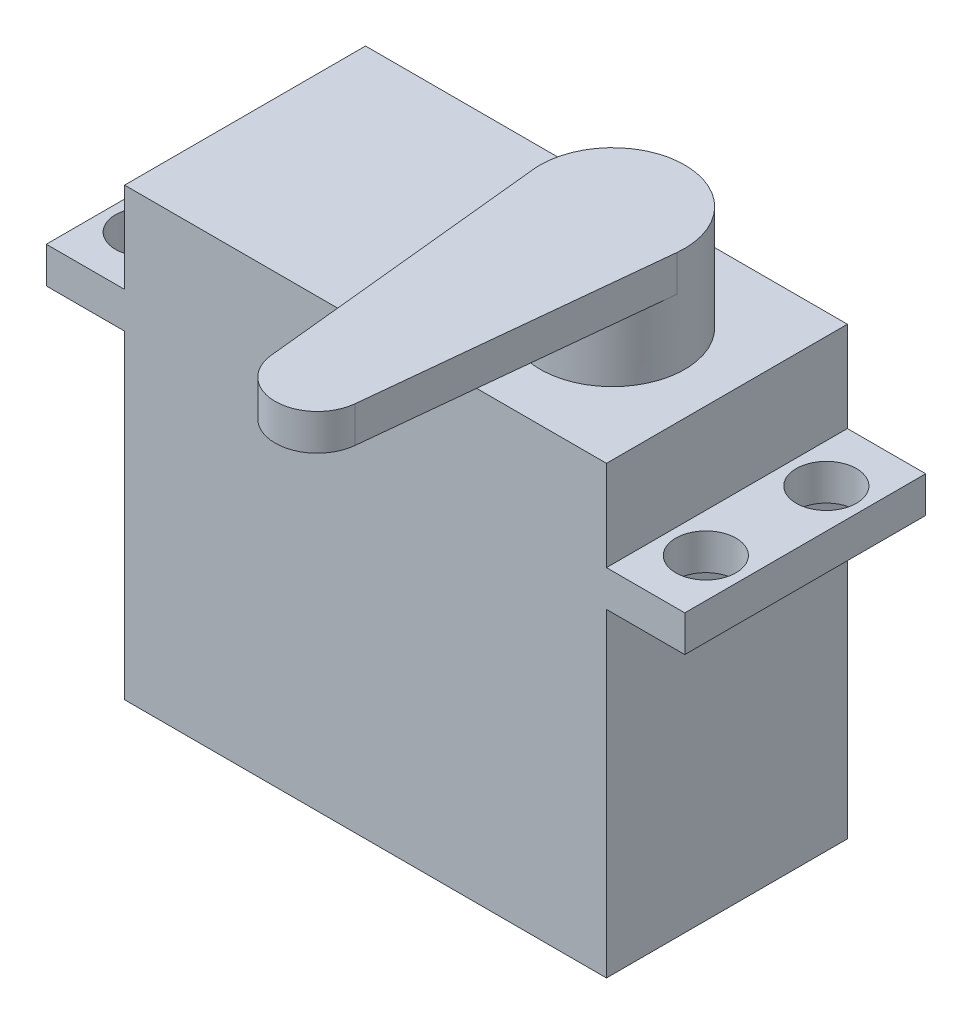
ISO-10303-21;
HEADER;
FILE_DESCRIPTION(('STEP AP214'),'2;1');
FILE_NAME('part.step','',(''),(''),'','','');
FILE_SCHEMA(('AUTOMOTIVE_DESIGN { 1 0 10303 214 1 1 1 1 }'));
ENDSEC;
DATA;
#1=APPLICATION_CONTEXT('core data for automotive mechanical design processes');
#2=APPLICATION_PROTOCOL_DEFINITION('international standard','automotive_design',2000,#1);
#3=PRODUCT_CONTEXT('',#1,'mechanical');
#4=PRODUCT('Part','Part','',(#3));
#5=PRODUCT_RELATED_PRODUCT_CATEGORY('part','',(#4));
#6=PRODUCT_DEFINITION_FORMATION('','',#4);
#7=PRODUCT_DEFINITION_CONTEXT('part definition',#1,'design');
#8=PRODUCT_DEFINITION('design','',#6,#7);
#9=PRODUCT_DEFINITION_SHAPE('','',#8);
#10=(LENGTH_UNIT() NAMED_UNIT(*) SI_UNIT(.MILLI.,.METRE.));
#11=(NAMED_UNIT(*) PLANE_ANGLE_UNIT() SI_UNIT($,.RADIAN.));
#12=(NAMED_UNIT(*) SI_UNIT($,.STERADIAN.) SOLID_ANGLE_UNIT());
#13=UNCERTAINTY_MEASURE_WITH_UNIT(LENGTH_MEASURE(1.E-05),#10,'distance_accuracy_value','');
#14=(GEOMETRIC_REPRESENTATION_CONTEXT(3) GLOBAL_UNCERTAINTY_ASSIGNED_CONTEXT((#13)) GLOBAL_UNIT_ASSIGNED_CONTEXT((#10,
#11,#12)) REPRESENTATION_CONTEXT('',''));
#15=CARTESIAN_POINT('',(0.,0.,0.));
#16=DIRECTION('',(0.,0.,1.));
#17=DIRECTION('',(1.,0.,0.));
#18=AXIS2_PLACEMENT_3D('',#15,#16,#17);
#19=CARTESIAN_POINT('',(30.5,0.,10.));
#20=DIRECTION('',(0.,1.,0.));
#21=DIRECTION('',(-1.,0.,0.));
#22=AXIS2_PLACEMENT_3D('',#19,#20,#21);
#23=CYLINDRICAL_SURFACE('',#22,5.99999999999999);
#24=CARTESIAN_POINT('',(30.5,0.,10.));
#25=DIRECTION('',(0.,1.,0.));
#26=DIRECTION('',(-1.,0.,0.));
#27=AXIS2_PLACEMENT_3D('',#24,#25,#26);
#28=CIRCLE('',#27,5.99999999999999);
#29=CARTESIAN_POINT('',(24.5,0.,10.));
#30=VERTEX_POINT('',#29);
#31=EDGE_CURVE('E187',#30,#30,#28,.T.);
#32=ORIENTED_EDGE('',*,*,#31,.T.);
#33=EDGE_LOOP('',(#32));
#34=FACE_BOUND('',#33,.T.);
#35=CARTESIAN_POINT('',(30.5,5.7,10.));
#36=DIRECTION('',(0.,1.,0.));
#37=DIRECTION('',(-1.,0.,0.));
#38=AXIS2_PLACEMENT_3D('',#35,#36,#37);
#39=CIRCLE('',#38,5.99999999999999);
#40=CARTESIAN_POINT('',(36.4686812768754,5.7,10.6122448979592));
#41=VERTEX_POINT('',#40);
#42=CARTESIAN_POINT('',(24.5313187231246,5.7,10.6122448979592));
#43=VERTEX_POINT('',#42);
#44=EDGE_CURVE('E11',#41,#43,#39,.F.);
#45=ORIENTED_EDGE('',*,*,#44,.T.);
#46=DIRECTION('',(0.,1.,0.));
#47=VECTOR('',#46,1.);
#48=CARTESIAN_POINT('',(24.5313187231246,5.7,10.6122448979592));
#49=LINE('',#48,#47);
#50=CARTESIAN_POINT('',(24.5313187231246,8.7,10.6122448979592));
#51=VERTEX_POINT('',#50);
#52=EDGE_CURVE('E177',#43,#51,#49,.T.);
#53=ORIENTED_EDGE('',*,*,#52,.T.);
#54=CARTESIAN_POINT('',(30.5,8.7,10.));
#55=DIRECTION('',(0.,1.,0.));
#56=DIRECTION('',(-1.,0.,0.));
#57=AXIS2_PLACEMENT_3D('',#54,#55,#56);
#58=CIRCLE('',#57,5.99999999999999);
#59=CARTESIAN_POINT('',(36.4686812768754,8.7,10.6122448979592));
#60=VERTEX_POINT('',#59);
#61=EDGE_CURVE('E175',#60,#51,#58,.T.);
#62=ORIENTED_EDGE('',*,*,#61,.F.);
#63=DIRECTION('',(0.,1.,0.));
#64=VECTOR('',#63,1.);
#65=CARTESIAN_POINT('',(36.4686812768754,5.7,10.6122448979592));
#66=LINE('',#65,#64);
#67=EDGE_CURVE('E168',#41,#60,#66,.T.);
#68=ORIENTED_EDGE('',*,*,#67,.F.);
#69=EDGE_LOOP('',(#45,#53,#62,#68));
#70=FACE_BOUND('',#69,.T.);
#71=ADVANCED_FACE('F41',(#34,#70),#23,.T.);
#72=CARTESIAN_POINT('',(40.,-37.,20.));
#73=DIRECTION('',(-1.,0.,0.));
#74=DIRECTION('',(0.,0.,1.));
#75=AXIS2_PLACEMENT_3D('',#72,#73,#74);
#76=PLANE('',#75);
#77=DIRECTION('',(0.,0.,1.));
#78=VECTOR('',#77,1.);
#79=CARTESIAN_POINT('',(40.,-7.49999999999999,0.));
#80=LINE('',#79,#78);
#81=CARTESIAN_POINT('',(40.,-7.49999999999999,0.));
#82=VERTEX_POINT('',#81);
#83=CARTESIAN_POINT('',(40.,-7.49999999999999,20.));
#84=VERTEX_POINT('',#83);
#85=EDGE_CURVE('E206',#82,#84,#80,.T.);
#86=ORIENTED_EDGE('',*,*,#85,.F.);
#87=DIRECTION('',(0.,1.,0.));
#88=VECTOR('',#87,1.);
#89=CARTESIAN_POINT('',(40.,-37.,0.));
#90=LINE('',#89,#88);
#91=CARTESIAN_POINT('',(40.,0.,0.));
#92=VERTEX_POINT('',#91);
#93=EDGE_CURVE('E293',#82,#92,#90,.T.);
#94=ORIENTED_EDGE('',*,*,#93,.T.);
#95=DIRECTION('',(0.,0.,-1.));
#96=VECTOR('',#95,1.);
#97=CARTESIAN_POINT('',(40.,0.,20.));
#98=LINE('',#97,#96);
#99=CARTESIAN_POINT('',(40.,0.,20.));
#100=VERTEX_POINT('',#99);
#101=EDGE_CURVE('E281',#100,#92,#98,.T.);
#102=ORIENTED_EDGE('',*,*,#101,.F.);
#103=DIRECTION('',(0.,1.,0.));
#104=VECTOR('',#103,1.);
#105=CARTESIAN_POINT('',(40.,-37.,20.));
#106=LINE('',#105,#104);
#107=EDGE_CURVE('E276',#84,#100,#106,.T.);
#108=ORIENTED_EDGE('',*,*,#107,.F.);
#109=EDGE_LOOP('',(#86,#94,#102,#108));
#110=FACE_BOUND('',#109,.T.);
#111=ADVANCED_FACE('F332',(#110),#76,.F.);
#112=CARTESIAN_POINT('',(0.,0.,20.));
#113=DIRECTION('',(1.,0.,0.));
#114=DIRECTION('',(0.,1.,0.));
#115=AXIS2_PLACEMENT_3D('',#112,#113,#114);
#116=PLANE('',#115);
#117=DIRECTION('',(0.,0.,1.));
#118=VECTOR('',#117,1.);
#119=CARTESIAN_POINT('',(0.,-10.5,0.));
#120=LINE('',#119,#118);
#121=CARTESIAN_POINT('',(0.,-10.5,0.));
#122=VERTEX_POINT('',#121);
#123=CARTESIAN_POINT('',(0.,-10.5,20.));
#124=VERTEX_POINT('',#123);
#125=EDGE_CURVE('E248',#122,#124,#120,.T.);
#126=ORIENTED_EDGE('',*,*,#125,.F.);
#127=DIRECTION('',(0.,-1.,0.));
#128=VECTOR('',#127,1.);
#129=CARTESIAN_POINT('',(0.,0.,0.));
#130=LINE('',#129,#128);
#131=CARTESIAN_POINT('',(0.,-37.,0.));
#132=VERTEX_POINT('',#131);
#133=EDGE_CURVE('E285',#122,#132,#130,.T.);
#134=ORIENTED_EDGE('',*,*,#133,.T.);
#135=DIRECTION('',(0.,0.,-1.));
#136=VECTOR('',#135,1.);
#137=CARTESIAN_POINT('',(0.,-37.,20.));
#138=LINE('',#137,#136);
#139=CARTESIAN_POINT('',(0.,-37.,20.));
#140=VERTEX_POINT('',#139);
#141=EDGE_CURVE('E304',#140,#132,#138,.T.);
#142=ORIENTED_EDGE('',*,*,#141,.F.);
#143=DIRECTION('',(0.,-1.,0.));
#144=VECTOR('',#143,1.);
#145=CARTESIAN_POINT('',(0.,0.,20.));
#146=LINE('',#145,#144);
#147=EDGE_CURVE('E267',#124,#140,#146,.T.);
#148=ORIENTED_EDGE('',*,*,#147,.F.);
#149=EDGE_LOOP('',(#126,#134,#142,#148));
#150=FACE_BOUND('',#149,.T.);
#151=ADVANCED_FACE('F424',(#150),#116,.F.);
#152=CARTESIAN_POINT('',(40.,0.,20.));
#153=DIRECTION('',(0.,-1.,0.));
#154=DIRECTION('',(1.,0.,0.));
#155=AXIS2_PLACEMENT_3D('',#152,#153,#154);
#156=PLANE('',#155);
#157=ORIENTED_EDGE('',*,*,#31,.F.);
#158=EDGE_LOOP('',(#157));
#159=FACE_BOUND('',#158,.T.);
#160=DIRECTION('',(-1.,0.,0.));
#161=VECTOR('',#160,1.);
#162=CARTESIAN_POINT('',(40.,0.,0.));
#163=LINE('',#162,#161);
#164=CARTESIAN_POINT('',(0.,0.,0.));
#165=VERTEX_POINT('',#164);
#166=EDGE_CURVE('E252',#92,#165,#163,.T.);
#167=ORIENTED_EDGE('',*,*,#166,.T.);
#168=DIRECTION('',(0.,0.,-1.));
#169=VECTOR('',#168,1.);
#170=CARTESIAN_POINT('',(0.,0.,20.));
#171=LINE('',#170,#169);
#172=CARTESIAN_POINT('',(0.,0.,20.));
#173=VERTEX_POINT('',#172);
#174=EDGE_CURVE('E50',#173,#165,#171,.T.);
#175=ORIENTED_EDGE('',*,*,#174,.F.);
#176=DIRECTION('',(-1.,0.,0.));
#177=VECTOR('',#176,1.);
#178=CARTESIAN_POINT('',(40.,0.,20.));
#179=LINE('',#178,#177);
#180=EDGE_CURVE('E263',#100,#173,#179,.T.);
#181=ORIENTED_EDGE('',*,*,#180,.F.);
#182=ORIENTED_EDGE('',*,*,#101,.T.);
#183=EDGE_LOOP('',(#167,#175,#181,#182));
#184=FACE_BOUND('',#183,.T.);
#185=ADVANCED_FACE('F43',(#159,#184),#156,.F.);
#186=CARTESIAN_POINT('',(0.,-7.5,0.));
#187=VERTEX_POINT('',#186);
#188=EDGE_CURVE('E286',#165,#187,#130,.T.);
#189=ORIENTED_EDGE('',*,*,#188,.T.);
#190=DIRECTION('',(0.,0.,1.));
#191=VECTOR('',#190,1.);
#192=CARTESIAN_POINT('',(0.,-7.5,0.));
#193=LINE('',#192,#191);
#194=CARTESIAN_POINT('',(0.,-7.5,20.));
#195=VERTEX_POINT('',#194);
#196=EDGE_CURVE('E238',#187,#195,#193,.T.);
#197=ORIENTED_EDGE('',*,*,#196,.T.);
#198=EDGE_CURVE('E269',#173,#195,#146,.T.);
#199=ORIENTED_EDGE('',*,*,#198,.F.);
#200=ORIENTED_EDGE('',*,*,#174,.T.);
#201=EDGE_LOOP('',(#189,#197,#199,#200));
#202=FACE_BOUND('',#201,.T.);
#203=ADVANCED_FACE('F311',(#202),#116,.F.);
#204=CARTESIAN_POINT('',(0.,-37.,20.));
#205=DIRECTION('',(0.,1.,0.));
#206=DIRECTION('',(-1.,0.,0.));
#207=AXIS2_PLACEMENT_3D('',#204,#205,#206);
#208=PLANE('',#207);
#209=DIRECTION('',(1.,0.,0.));
#210=VECTOR('',#209,1.);
#211=CARTESIAN_POINT('',(0.,-37.,0.));
#212=LINE('',#211,#210);
#213=CARTESIAN_POINT('',(40.,-37.,0.));
#214=VERTEX_POINT('',#213);
#215=EDGE_CURVE('E290',#132,#214,#212,.T.);
#216=ORIENTED_EDGE('',*,*,#215,.T.);
#217=DIRECTION('',(0.,0.,-1.));
#218=VECTOR('',#217,1.);
#219=CARTESIAN_POINT('',(40.,-37.,20.));
#220=LINE('',#219,#218);
#221=CARTESIAN_POINT('',(40.,-37.,20.));
#222=VERTEX_POINT('',#221);
#223=EDGE_CURVE('E300',#222,#214,#220,.T.);
#224=ORIENTED_EDGE('',*,*,#223,.F.);
#225=DIRECTION('',(1.,0.,0.));
#226=VECTOR('',#225,1.);
#227=CARTESIAN_POINT('',(0.,-37.,20.));
#228=LINE('',#227,#226);
#229=EDGE_CURVE('E273',#140,#222,#228,.T.);
#230=ORIENTED_EDGE('',*,*,#229,.F.);
#231=ORIENTED_EDGE('',*,*,#141,.T.);
#232=EDGE_LOOP('',(#216,#224,#230,#231));
#233=FACE_BOUND('',#232,.T.);
#234=ADVANCED_FACE('F418',(#233),#208,.F.);
#235=CARTESIAN_POINT('',(40.,-10.5,0.));
#236=VERTEX_POINT('',#235);
#237=EDGE_CURVE('E268',#214,#236,#90,.T.);
#238=ORIENTED_EDGE('',*,*,#237,.T.);
#239=DIRECTION('',(0.,0.,1.));
#240=VECTOR('',#239,1.);
#241=CARTESIAN_POINT('',(40.,-10.5,0.));
#242=LINE('',#241,#240);
#243=CARTESIAN_POINT('',(40.,-10.5,20.));
#244=VERTEX_POINT('',#243);
#245=EDGE_CURVE('E222',#236,#244,#242,.T.);
#246=ORIENTED_EDGE('',*,*,#245,.T.);
#247=EDGE_CURVE('E277',#222,#244,#106,.T.);
#248=ORIENTED_EDGE('',*,*,#247,.F.);
#249=ORIENTED_EDGE('',*,*,#223,.T.);
#250=EDGE_LOOP('',(#238,#246,#248,#249));
#251=FACE_BOUND('',#250,.T.);
#252=ADVANCED_FACE('F413',(#251),#76,.F.);
#253=CARTESIAN_POINT('',(0.,0.,20.));
#254=DIRECTION('',(0.,0.,1.));
#255=DIRECTION('',(1.,0.,0.));
#256=AXIS2_PLACEMENT_3D('',#253,#254,#255);
#257=PLANE('',#256);
#258=ORIENTED_EDGE('',*,*,#180,.T.);
#259=ORIENTED_EDGE('',*,*,#198,.T.);
#260=DIRECTION('',(-1.,0.,0.));
#261=VECTOR('',#260,1.);
#262=CARTESIAN_POINT('',(0.,-7.5,20.));
#263=LINE('',#262,#261);
#264=CARTESIAN_POINT('',(-6.5,-7.5,20.));
#265=VERTEX_POINT('',#264);
#266=EDGE_CURVE('E218',#195,#265,#263,.T.);
#267=ORIENTED_EDGE('',*,*,#266,.T.);
#268=DIRECTION('',(0.,1.,0.));
#269=VECTOR('',#268,1.);
#270=CARTESIAN_POINT('',(-6.5,0.,20.));
#271=LINE('',#270,#269);
#272=CARTESIAN_POINT('',(-6.5,-10.5,20.));
#273=VERTEX_POINT('',#272);
#274=EDGE_CURVE('E242',#273,#265,#271,.T.);
#275=ORIENTED_EDGE('',*,*,#274,.F.);
#276=DIRECTION('',(-1.,0.,0.));
#277=VECTOR('',#276,1.);
#278=CARTESIAN_POINT('',(0.,-10.5,20.));
#279=LINE('',#278,#277);
#280=EDGE_CURVE('E232',#124,#273,#279,.T.);
#281=ORIENTED_EDGE('',*,*,#280,.F.);
#282=ORIENTED_EDGE('',*,*,#147,.T.);
#283=ORIENTED_EDGE('',*,*,#229,.T.);
#284=ORIENTED_EDGE('',*,*,#247,.T.);
#285=DIRECTION('',(1.,0.,0.));
#286=VECTOR('',#285,1.);
#287=CARTESIAN_POINT('',(0.,-10.5,20.));
#288=LINE('',#287,#286);
#289=CARTESIAN_POINT('',(46.5,-10.5,20.));
#290=VERTEX_POINT('',#289);
#291=EDGE_CURVE('E65',#244,#290,#288,.T.);
#292=ORIENTED_EDGE('',*,*,#291,.T.);
#293=DIRECTION('',(0.,1.,0.));
#294=VECTOR('',#293,1.);
#295=CARTESIAN_POINT('',(46.5,0.,20.));
#296=LINE('',#295,#294);
#297=CARTESIAN_POINT('',(46.5,-7.49999999999999,20.));
#298=VERTEX_POINT('',#297);
#299=EDGE_CURVE('E198',#290,#298,#296,.T.);
#300=ORIENTED_EDGE('',*,*,#299,.T.);
#301=DIRECTION('',(1.,0.,0.));
#302=VECTOR('',#301,1.);
#303=CARTESIAN_POINT('',(0.,-7.49999999999999,20.));
#304=LINE('',#303,#302);
#305=EDGE_CURVE('E191',#84,#298,#304,.T.);
#306=ORIENTED_EDGE('',*,*,#305,.F.);
#307=ORIENTED_EDGE('',*,*,#107,.T.);
#308=EDGE_LOOP('',(#258,#259,#267,#275,#281,#282,#283,#284,#292,#300,#306,#307));
#309=FACE_BOUND('',#308,.T.);
#310=ADVANCED_FACE('F325',(#309),#257,.T.);
#311=CARTESIAN_POINT('',(0.,0.,0.));
#312=DIRECTION('',(0.,0.,1.));
#313=DIRECTION('',(1.,0.,0.));
#314=AXIS2_PLACEMENT_3D('',#311,#312,#313);
#315=PLANE('',#314);
#316=ORIENTED_EDGE('',*,*,#166,.F.);
#317=ORIENTED_EDGE('',*,*,#93,.F.);
#318=DIRECTION('',(1.,0.,0.));
#319=VECTOR('',#318,1.);
#320=CARTESIAN_POINT('',(0.,-7.49999999999999,0.));
#321=LINE('',#320,#319);
#322=CARTESIAN_POINT('',(46.5,-7.49999999999999,0.));
#323=VERTEX_POINT('',#322);
#324=EDGE_CURVE('E194',#82,#323,#321,.T.);
#325=ORIENTED_EDGE('',*,*,#324,.T.);
#326=DIRECTION('',(0.,1.,0.));
#327=VECTOR('',#326,1.);
#328=CARTESIAN_POINT('',(46.5,0.,0.));
#329=LINE('',#328,#327);
#330=CARTESIAN_POINT('',(46.5,-10.5,0.));
#331=VERTEX_POINT('',#330);
#332=EDGE_CURVE('E202',#331,#323,#329,.T.);
#333=ORIENTED_EDGE('',*,*,#332,.F.);
#334=DIRECTION('',(1.,0.,0.));
#335=VECTOR('',#334,1.);
#336=CARTESIAN_POINT('',(0.,-10.5,0.));
#337=LINE('',#336,#335);
#338=EDGE_CURVE('E197',#236,#331,#337,.T.);
#339=ORIENTED_EDGE('',*,*,#338,.F.);
#340=ORIENTED_EDGE('',*,*,#237,.F.);
#341=ORIENTED_EDGE('',*,*,#215,.F.);
#342=ORIENTED_EDGE('',*,*,#133,.F.);
#343=DIRECTION('',(-1.,0.,0.));
#344=VECTOR('',#343,1.);
#345=CARTESIAN_POINT('',(0.,-10.5,0.));
#346=LINE('',#345,#344);
#347=CARTESIAN_POINT('',(-6.5,-10.5,0.));
#348=VERTEX_POINT('',#347);
#349=EDGE_CURVE('E235',#122,#348,#346,.T.);
#350=ORIENTED_EDGE('',*,*,#349,.T.);
#351=DIRECTION('',(0.,1.,0.));
#352=VECTOR('',#351,1.);
#353=CARTESIAN_POINT('',(-6.5,0.,0.));
#354=LINE('',#353,#352);
#355=CARTESIAN_POINT('',(-6.5,-7.5,0.));
#356=VERTEX_POINT('',#355);
#357=EDGE_CURVE('E231',#348,#356,#354,.T.);
#358=ORIENTED_EDGE('',*,*,#357,.T.);
#359=DIRECTION('',(-1.,0.,0.));
#360=VECTOR('',#359,1.);
#361=CARTESIAN_POINT('',(0.,-7.5,0.));
#362=LINE('',#361,#360);
#363=EDGE_CURVE('E227',#187,#356,#362,.T.);
#364=ORIENTED_EDGE('',*,*,#363,.F.);
#365=ORIENTED_EDGE('',*,*,#188,.F.);
#366=EDGE_LOOP('',(#316,#317,#325,#333,#339,#340,#341,#342,#350,#358,#364,#365));
#367=FACE_BOUND('',#366,.T.);
#368=ADVANCED_FACE('F318',(#367),#315,.F.);
#369=CARTESIAN_POINT('',(0.,-10.5,0.));
#370=DIRECTION('',(0.,1.,0.));
#371=DIRECTION('',(0.,0.,1.));
#372=AXIS2_PLACEMENT_3D('',#369,#370,#371);
#373=PLANE('',#372);
#374=CARTESIAN_POINT('',(-3.25,-10.5,15.));
#375=DIRECTION('',(0.,-1.,0.));
#376=DIRECTION('',(0.,0.,-1.));
#377=AXIS2_PLACEMENT_3D('',#374,#375,#376);
#378=CIRCLE('',#377,2.5);
#379=CARTESIAN_POINT('',(-3.25,-10.5,12.5));
#380=VERTEX_POINT('',#379);
#381=EDGE_CURVE('E363',#380,#380,#378,.T.);
#382=ORIENTED_EDGE('',*,*,#381,.F.);
#383=EDGE_LOOP('',(#382));
#384=FACE_BOUND('',#383,.T.);
#385=CARTESIAN_POINT('',(-3.25,-10.5,5.));
#386=DIRECTION('',(0.,-1.,0.));
#387=DIRECTION('',(0.,0.,-1.));
#388=AXIS2_PLACEMENT_3D('',#385,#386,#387);
#389=CIRCLE('',#388,2.5);
#390=CARTESIAN_POINT('',(-3.25,-10.5,2.5));
#391=VERTEX_POINT('',#390);
#392=EDGE_CURVE('E371',#391,#391,#389,.T.);
#393=ORIENTED_EDGE('',*,*,#392,.F.);
#394=EDGE_LOOP('',(#393));
#395=FACE_BOUND('',#394,.T.);
#396=ORIENTED_EDGE('',*,*,#280,.T.);
#397=DIRECTION('',(0.,0.,1.));
#398=VECTOR('',#397,1.);
#399=CARTESIAN_POINT('',(-6.5,-10.5,0.));
#400=LINE('',#399,#398);
#401=EDGE_CURVE('E253',#348,#273,#400,.T.);
#402=ORIENTED_EDGE('',*,*,#401,.F.);
#403=ORIENTED_EDGE('',*,*,#349,.F.);
#404=ORIENTED_EDGE('',*,*,#125,.T.);
#405=EDGE_LOOP('',(#396,#402,#403,#404));
#406=FACE_BOUND('',#405,.T.);
#407=ADVANCED_FACE('F427',(#384,#395,#406),#373,.F.);
#408=CARTESIAN_POINT('',(-6.5,0.,0.));
#409=DIRECTION('',(1.,0.,0.));
#410=DIRECTION('',(0.,0.,-1.));
#411=AXIS2_PLACEMENT_3D('',#408,#409,#410);
#412=PLANE('',#411);
#413=ORIENTED_EDGE('',*,*,#274,.T.);
#414=DIRECTION('',(0.,0.,1.));
#415=VECTOR('',#414,1.);
#416=CARTESIAN_POINT('',(-6.5,-7.5,0.));
#417=LINE('',#416,#415);
#418=EDGE_CURVE('E257',#356,#265,#417,.T.);
#419=ORIENTED_EDGE('',*,*,#418,.F.);
#420=ORIENTED_EDGE('',*,*,#357,.F.);
#421=ORIENTED_EDGE('',*,*,#401,.T.);
#422=EDGE_LOOP('',(#413,#419,#420,#421));
#423=FACE_BOUND('',#422,.T.);
#424=ADVANCED_FACE('F429',(#423),#412,.F.);
#425=CARTESIAN_POINT('',(0.,-7.5,0.));
#426=DIRECTION('',(0.,1.,0.));
#427=DIRECTION('',(0.,0.,1.));
#428=AXIS2_PLACEMENT_3D('',#425,#426,#427);
#429=PLANE('',#428);
#430=CARTESIAN_POINT('',(-3.25,-7.5,15.));
#431=DIRECTION('',(0.,1.,0.));
#432=DIRECTION('',(0.,0.,1.));
#433=AXIS2_PLACEMENT_3D('',#430,#431,#432);
#434=CIRCLE('',#433,2.5);
#435=CARTESIAN_POINT('',(-3.25,-7.5,17.5));
#436=VERTEX_POINT('',#435);
#437=EDGE_CURVE('E359',#436,#436,#434,.F.);
#438=ORIENTED_EDGE('',*,*,#437,.T.);
#439=EDGE_LOOP('',(#438));
#440=FACE_BOUND('',#439,.T.);
#441=CARTESIAN_POINT('',(-3.25,-7.5,5.));
#442=DIRECTION('',(0.,1.,0.));
#443=DIRECTION('',(0.,0.,1.));
#444=AXIS2_PLACEMENT_3D('',#441,#442,#443);
#445=CIRCLE('',#444,2.5);
#446=CARTESIAN_POINT('',(-3.25,-7.5,7.5));
#447=VERTEX_POINT('',#446);
#448=EDGE_CURVE('E367',#447,#447,#445,.F.);
#449=ORIENTED_EDGE('',*,*,#448,.T.);
#450=EDGE_LOOP('',(#449));
#451=FACE_BOUND('',#450,.T.);
#452=ORIENTED_EDGE('',*,*,#266,.F.);
#453=ORIENTED_EDGE('',*,*,#196,.F.);
#454=ORIENTED_EDGE('',*,*,#363,.T.);
#455=ORIENTED_EDGE('',*,*,#418,.T.);
#456=EDGE_LOOP('',(#452,#453,#454,#455));
#457=FACE_BOUND('',#456,.T.);
#458=ADVANCED_FACE('F323',(#440,#451,#457),#429,.T.);
#459=CARTESIAN_POINT('',(0.,-7.49999999999999,0.));
#460=DIRECTION('',(0.,-1.,0.));
#461=DIRECTION('',(0.,0.,-1.));
#462=AXIS2_PLACEMENT_3D('',#459,#460,#461);
#463=PLANE('',#462);
#464=CARTESIAN_POINT('',(43.25,-7.49999999999999,5.));
#465=DIRECTION('',(0.,-1.,0.));
#466=DIRECTION('',(0.,0.,-1.));
#467=AXIS2_PLACEMENT_3D('',#464,#465,#466);
#468=CIRCLE('',#467,2.5);
#469=CARTESIAN_POINT('',(43.25,-7.49999999999999,2.5));
#470=VERTEX_POINT('',#469);
#471=EDGE_CURVE('E358',#470,#470,#468,.F.);
#472=ORIENTED_EDGE('',*,*,#471,.F.);
#473=EDGE_LOOP('',(#472));
#474=FACE_BOUND('',#473,.T.);
#475=CARTESIAN_POINT('',(43.25,-7.49999999999999,15.));
#476=DIRECTION('',(0.,-1.,0.));
#477=DIRECTION('',(0.,0.,-1.));
#478=AXIS2_PLACEMENT_3D('',#475,#476,#477);
#479=CIRCLE('',#478,2.5);
#480=CARTESIAN_POINT('',(43.25,-7.49999999999999,12.5));
#481=VERTEX_POINT('',#480);
#482=EDGE_CURVE('E347',#481,#481,#479,.F.);
#483=ORIENTED_EDGE('',*,*,#482,.F.);
#484=EDGE_LOOP('',(#483));
#485=FACE_BOUND('',#484,.T.);
#486=ORIENTED_EDGE('',*,*,#305,.T.);
#487=DIRECTION('',(0.,0.,1.));
#488=VECTOR('',#487,1.);
#489=CARTESIAN_POINT('',(46.5,-7.49999999999999,0.));
#490=LINE('',#489,#488);
#491=EDGE_CURVE('E215',#323,#298,#490,.T.);
#492=ORIENTED_EDGE('',*,*,#491,.F.);
#493=ORIENTED_EDGE('',*,*,#324,.F.);
#494=ORIENTED_EDGE('',*,*,#85,.T.);
#495=EDGE_LOOP('',(#486,#492,#493,#494));
#496=FACE_BOUND('',#495,.T.);
#497=ADVANCED_FACE('F400',(#474,#485,#496),#463,.F.);
#498=CARTESIAN_POINT('',(46.5,0.,0.));
#499=DIRECTION('',(1.,0.,0.));
#500=DIRECTION('',(0.,0.,-1.));
#501=AXIS2_PLACEMENT_3D('',#498,#499,#500);
#502=PLANE('',#501);
#503=ORIENTED_EDGE('',*,*,#299,.F.);
#504=DIRECTION('',(0.,0.,1.));
#505=VECTOR('',#504,1.);
#506=CARTESIAN_POINT('',(46.5,-10.5,0.));
#507=LINE('',#506,#505);
#508=EDGE_CURVE('E219',#331,#290,#507,.T.);
#509=ORIENTED_EDGE('',*,*,#508,.F.);
#510=ORIENTED_EDGE('',*,*,#332,.T.);
#511=ORIENTED_EDGE('',*,*,#491,.T.);
#512=EDGE_LOOP('',(#503,#509,#510,#511));
#513=FACE_BOUND('',#512,.T.);
#514=ADVANCED_FACE('F390',(#513),#502,.T.);
#515=CARTESIAN_POINT('',(0.,-10.5,0.));
#516=DIRECTION('',(0.,-1.,0.));
#517=DIRECTION('',(0.,0.,-1.));
#518=AXIS2_PLACEMENT_3D('',#515,#516,#517);
#519=PLANE('',#518);
#520=CARTESIAN_POINT('',(43.25,-10.5,5.));
#521=DIRECTION('',(0.,-1.,0.));
#522=DIRECTION('',(0.,0.,-1.));
#523=AXIS2_PLACEMENT_3D('',#520,#521,#522);
#524=CIRCLE('',#523,2.5);
#525=CARTESIAN_POINT('',(43.25,-10.5,2.5));
#526=VERTEX_POINT('',#525);
#527=EDGE_CURVE('E375',#526,#526,#524,.T.);
#528=ORIENTED_EDGE('',*,*,#527,.F.);
#529=EDGE_LOOP('',(#528));
#530=FACE_BOUND('',#529,.T.);
#531=CARTESIAN_POINT('',(43.25,-10.5,15.));
#532=DIRECTION('',(0.,-1.,0.));
#533=DIRECTION('',(0.,0.,-1.));
#534=AXIS2_PLACEMENT_3D('',#531,#532,#533);
#535=CIRCLE('',#534,2.5);
#536=CARTESIAN_POINT('',(43.25,-10.5,12.5));
#537=VERTEX_POINT('',#536);
#538=EDGE_CURVE('E354',#537,#537,#535,.T.);
#539=ORIENTED_EDGE('',*,*,#538,.F.);
#540=EDGE_LOOP('',(#539));
#541=FACE_BOUND('',#540,.T.);
#542=ORIENTED_EDGE('',*,*,#291,.F.);
#543=ORIENTED_EDGE('',*,*,#245,.F.);
#544=ORIENTED_EDGE('',*,*,#338,.T.);
#545=ORIENTED_EDGE('',*,*,#508,.T.);
#546=EDGE_LOOP('',(#542,#543,#544,#545));
#547=FACE_BOUND('',#546,.T.);
#548=ADVANCED_FACE('F386',(#530,#541,#547),#519,.T.);
#549=CARTESIAN_POINT('',(0.,8.7,0.));
#550=DIRECTION('',(0.,1.,0.));
#551=DIRECTION('',(-1.,0.,0.));
#552=AXIS2_PLACEMENT_3D('',#549,#550,#551);
#553=PLANE('',#552);
#554=ORIENTED_EDGE('',*,*,#61,.T.);
#555=DIRECTION('',(0.102040816326531,0.,0.994780212812567));
#556=VECTOR('',#555,1.);
#557=CARTESIAN_POINT('',(23.19866086332,8.7,-2.37963146199163));
#558=LINE('',#557,#556);
#559=CARTESIAN_POINT('',(27.018269255156,8.7,34.8571428571429));
#560=VERTEX_POINT('',#559);
#561=EDGE_CURVE('E343',#51,#560,#558,.T.);
#562=ORIENTED_EDGE('',*,*,#561,.T.);
#563=CARTESIAN_POINT('',(30.5,8.7,34.5));
#564=DIRECTION('',(0.,1.,0.));
#565=DIRECTION('',(-1.,0.,0.));
#566=AXIS2_PLACEMENT_3D('',#563,#564,#565);
#567=CIRCLE('',#566,3.49999999999999);
#568=CARTESIAN_POINT('',(33.981730744844,8.7,34.8571428571429));
#569=VERTEX_POINT('',#568);
#570=EDGE_CURVE('E173',#560,#569,#567,.T.);
#571=ORIENTED_EDGE('',*,*,#570,.T.);
#572=DIRECTION('',(-0.10204081632653,0.,0.994780212812567));
#573=VECTOR('',#572,1.);
#574=CARTESIAN_POINT('',(37.1661871166883,8.7,3.81236782184166));
#575=LINE('',#574,#573);
#576=EDGE_CURVE('E57',#60,#569,#575,.T.);
#577=ORIENTED_EDGE('',*,*,#576,.F.);
#578=EDGE_LOOP('',(#554,#562,#571,#577));
#579=FACE_BOUND('',#578,.T.);
#580=ADVANCED_FACE('F389',(#579),#553,.T.);
#581=CARTESIAN_POINT('',(37.1661871166883,5.7,3.81236782184166));
#582=DIRECTION('',(-0.994780212812567,0.,-0.10204081632653));
#583=DIRECTION('',(-0.10204081632653,0.,0.994780212812567));
#584=AXIS2_PLACEMENT_3D('',#581,#582,#583);
#585=PLANE('',#584);
#586=ORIENTED_EDGE('',*,*,#576,.T.);
#587=DIRECTION('',(0.,1.,0.));
#588=VECTOR('',#587,1.);
#589=CARTESIAN_POINT('',(33.981730744844,5.7,34.8571428571429));
#590=LINE('',#589,#588);
#591=CARTESIAN_POINT('',(33.981730744844,5.7,34.8571428571429));
#592=VERTEX_POINT('',#591);
#593=EDGE_CURVE('E170',#592,#569,#590,.T.);
#594=ORIENTED_EDGE('',*,*,#593,.F.);
#595=DIRECTION('',(-0.10204081632653,0.,0.994780212812567));
#596=VECTOR('',#595,1.);
#597=CARTESIAN_POINT('',(37.1661871166883,5.7,3.81236782184166));
#598=LINE('',#597,#596);
#599=EDGE_CURVE('E159',#41,#592,#598,.T.);
#600=ORIENTED_EDGE('',*,*,#599,.F.);
#601=ORIENTED_EDGE('',*,*,#67,.T.);
#602=EDGE_LOOP('',(#586,#594,#600,#601));
#603=FACE_BOUND('',#602,.T.);
#604=ADVANCED_FACE('F167',(#603),#585,.F.);
#605=CARTESIAN_POINT('',(30.5,5.7,34.5));
#606=DIRECTION('',(0.,1.,0.));
#607=DIRECTION('',(-1.,0.,0.));
#608=AXIS2_PLACEMENT_3D('',#605,#606,#607);
#609=CYLINDRICAL_SURFACE('',#608,3.49999999999999);
#610=ORIENTED_EDGE('',*,*,#570,.F.);
#611=DIRECTION('',(0.,1.,0.));
#612=VECTOR('',#611,1.);
#613=CARTESIAN_POINT('',(27.018269255156,5.7,34.8571428571429));
#614=LINE('',#613,#612);
#615=CARTESIAN_POINT('',(27.018269255156,5.7,34.8571428571429));
#616=VERTEX_POINT('',#615);
#617=EDGE_CURVE('E182',#616,#560,#614,.T.);
#618=ORIENTED_EDGE('',*,*,#617,.F.);
#619=CARTESIAN_POINT('',(30.5,5.7,34.5));
#620=DIRECTION('',(0.,1.,0.));
#621=DIRECTION('',(-1.,0.,0.));
#622=AXIS2_PLACEMENT_3D('',#619,#620,#621);
#623=CIRCLE('',#622,3.49999999999999);
#624=EDGE_CURVE('E178',#616,#592,#623,.T.);
#625=ORIENTED_EDGE('',*,*,#624,.T.);
#626=ORIENTED_EDGE('',*,*,#593,.T.);
#627=EDGE_LOOP('',(#610,#618,#625,#626));
#628=FACE_BOUND('',#627,.T.);
#629=ADVANCED_FACE('F473',(#628),#609,.T.);
#630=CARTESIAN_POINT('',(23.19866086332,5.7,-2.37963146199163));
#631=DIRECTION('',(-0.994780212812566,0.,0.10204081632653));
#632=DIRECTION('',(0.102040816326531,0.,0.994780212812567));
#633=AXIS2_PLACEMENT_3D('',#630,#631,#632);
#634=PLANE('',#633);
#635=ORIENTED_EDGE('',*,*,#561,.F.);
#636=ORIENTED_EDGE('',*,*,#52,.F.);
#637=DIRECTION('',(0.102040816326531,0.,0.994780212812567));
#638=VECTOR('',#637,1.);
#639=CARTESIAN_POINT('',(23.19866086332,5.7,-2.37963146199163));
#640=LINE('',#639,#638);
#641=EDGE_CURVE('E162',#43,#616,#640,.T.);
#642=ORIENTED_EDGE('',*,*,#641,.T.);
#643=ORIENTED_EDGE('',*,*,#617,.T.);
#644=EDGE_LOOP('',(#635,#636,#642,#643));
#645=FACE_BOUND('',#644,.T.);
#646=ADVANCED_FACE('F479',(#645),#634,.T.);
#647=CARTESIAN_POINT('',(0.,5.7,0.));
#648=DIRECTION('',(0.,1.,0.));
#649=DIRECTION('',(-1.,0.,0.));
#650=AXIS2_PLACEMENT_3D('',#647,#648,#649);
#651=PLANE('',#650);
#652=ORIENTED_EDGE('',*,*,#44,.F.);
#653=ORIENTED_EDGE('',*,*,#599,.T.);
#654=ORIENTED_EDGE('',*,*,#624,.F.);
#655=ORIENTED_EDGE('',*,*,#641,.F.);
#656=EDGE_LOOP('',(#652,#653,#654,#655));
#657=FACE_BOUND('',#656,.T.);
#658=ADVANCED_FACE('F157',(#657),#651,.F.);
#659=CARTESIAN_POINT('',(43.25,8.701,15.));
#660=DIRECTION('',(0.,-1.,0.));
#661=DIRECTION('',(0.,0.,-1.));
#662=AXIS2_PLACEMENT_3D('',#659,#660,#661);
#663=CYLINDRICAL_SURFACE('',#662,2.5);
#664=ORIENTED_EDGE('',*,*,#538,.T.);
#665=EDGE_LOOP('',(#664));
#666=FACE_BOUND('',#665,.T.);
#667=ORIENTED_EDGE('',*,*,#482,.T.);
#668=EDGE_LOOP('',(#667));
#669=FACE_BOUND('',#668,.T.);
#670=ADVANCED_FACE('F394',(#666,#669),#663,.F.);
#671=CARTESIAN_POINT('',(43.25,8.701,5.));
#672=DIRECTION('',(0.,-1.,0.));
#673=DIRECTION('',(0.,0.,-1.));
#674=AXIS2_PLACEMENT_3D('',#671,#672,#673);
#675=CYLINDRICAL_SURFACE('',#674,2.5);
#676=ORIENTED_EDGE('',*,*,#527,.T.);
#677=EDGE_LOOP('',(#676));
#678=FACE_BOUND('',#677,.T.);
#679=ORIENTED_EDGE('',*,*,#471,.T.);
#680=EDGE_LOOP('',(#679));
#681=FACE_BOUND('',#680,.T.);
#682=ADVANCED_FACE('F383',(#678,#681),#675,.F.);
#683=CARTESIAN_POINT('',(-3.25,8.701,5.));
#684=DIRECTION('',(0.,-1.,0.));
#685=DIRECTION('',(0.,0.,-1.));
#686=AXIS2_PLACEMENT_3D('',#683,#684,#685);
#687=CYLINDRICAL_SURFACE('',#686,2.5);
#688=ORIENTED_EDGE('',*,*,#448,.F.);
#689=EDGE_LOOP('',(#688));
#690=FACE_BOUND('',#689,.T.);
#691=ORIENTED_EDGE('',*,*,#392,.T.);
#692=EDGE_LOOP('',(#691));
#693=FACE_BOUND('',#692,.T.);
#694=ADVANCED_FACE('F503',(#690,#693),#687,.F.);
#695=CARTESIAN_POINT('',(-3.25,8.701,15.));
#696=DIRECTION('',(0.,-1.,0.));
#697=DIRECTION('',(0.,0.,-1.));
#698=AXIS2_PLACEMENT_3D('',#695,#696,#697);
#699=CYLINDRICAL_SURFACE('',#698,2.5);
#700=ORIENTED_EDGE('',*,*,#437,.F.);
#701=EDGE_LOOP('',(#700));
#702=FACE_BOUND('',#701,.T.);
#703=ORIENTED_EDGE('',*,*,#381,.T.);
#704=EDGE_LOOP('',(#703));
#705=FACE_BOUND('',#704,.T.);
#706=ADVANCED_FACE('F510',(#702,#705),#699,.F.);
#707=CLOSED_SHELL('',(#71,#111,#151,#185,#203,#234,#252,#310,#368,#407,#424,#458,#497,#514,#548,
#580,#604,#629,#646,#658,#670,#682,#694,#706));
#708=MANIFOLD_SOLID_BREP('B2',#707);
#709=ADVANCED_BREP_SHAPE_REPRESENTATION('',(#18,#708),#14);
#710=SHAPE_DEFINITION_REPRESENTATION(#9,#709);
ENDSEC;
END-ISO-10303-21;
